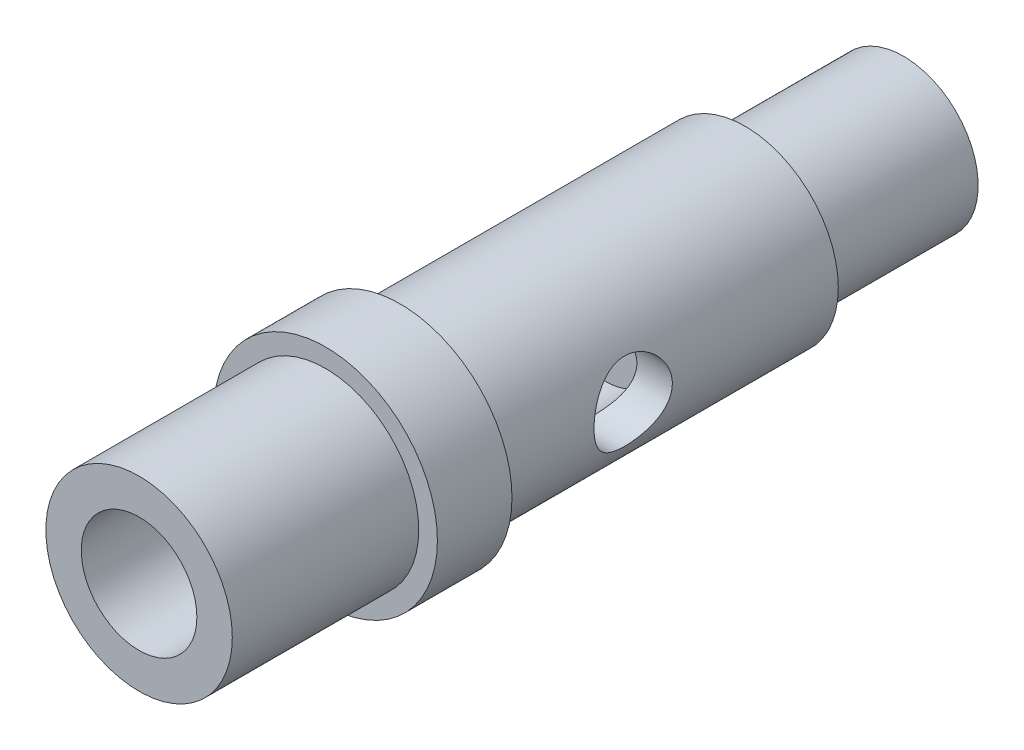
ISO-10303-21;
HEADER;
FILE_DESCRIPTION(('STEP AP214'),'2;1');
FILE_NAME('part.step','',(''),(''),'','','');
FILE_SCHEMA(('AUTOMOTIVE_DESIGN { 1 0 10303 214 1 1 1 1 }'));
ENDSEC;
DATA;
#1=APPLICATION_CONTEXT('core data for automotive mechanical design processes');
#2=APPLICATION_PROTOCOL_DEFINITION('international standard','automotive_design',2000,#1);
#3=PRODUCT_CONTEXT('',#1,'mechanical');
#4=PRODUCT('Part','Part','',(#3));
#5=PRODUCT_RELATED_PRODUCT_CATEGORY('part','',(#4));
#6=PRODUCT_DEFINITION_FORMATION('','',#4);
#7=PRODUCT_DEFINITION_CONTEXT('part definition',#1,'design');
#8=PRODUCT_DEFINITION('design','',#6,#7);
#9=PRODUCT_DEFINITION_SHAPE('','',#8);
#10=(LENGTH_UNIT() NAMED_UNIT(*) SI_UNIT(.MILLI.,.METRE.));
#11=(NAMED_UNIT(*) PLANE_ANGLE_UNIT() SI_UNIT($,.RADIAN.));
#12=(NAMED_UNIT(*) SI_UNIT($,.STERADIAN.) SOLID_ANGLE_UNIT());
#13=UNCERTAINTY_MEASURE_WITH_UNIT(LENGTH_MEASURE(1.E-05),#10,'distance_accuracy_value','');
#14=(GEOMETRIC_REPRESENTATION_CONTEXT(3) GLOBAL_UNCERTAINTY_ASSIGNED_CONTEXT((#13)) GLOBAL_UNIT_ASSIGNED_CONTEXT((#10,
#11,#12)) REPRESENTATION_CONTEXT('',''));
#15=CARTESIAN_POINT('',(0.,0.,0.));
#16=DIRECTION('',(0.,0.,1.));
#17=DIRECTION('',(1.,0.,0.));
#18=AXIS2_PLACEMENT_3D('',#15,#16,#17);
#19=CARTESIAN_POINT('',(0.,0.,18.5));
#20=DIRECTION('',(0.,0.,-1.));
#21=DIRECTION('',(-1.,0.,0.));
#22=AXIS2_PLACEMENT_3D('',#19,#20,#21);
#23=CYLINDRICAL_SURFACE('',#22,5.);
#24=CARTESIAN_POINT('',(-5.,0.,13.1));
#25=CARTESIAN_POINT('',(-4.99999333081063,-0.112421260581154,13.0999912513358));
#26=CARTESIAN_POINT('',(-4.99616592841195,-0.225000407186862,13.0909214164188));
#27=CARTESIAN_POINT('',(-4.98123118003201,-0.446972248377444,13.0549745053768));
#28=CARTESIAN_POINT('',(-4.97010500635269,-0.556355935732331,13.0280513734512));
#29=CARTESIAN_POINT('',(-4.94176430599483,-0.768350398152641,12.9575669353113));
#30=CARTESIAN_POINT('',(-4.92457055376414,-0.870982883258442,12.9140623611996));
#31=CARTESIAN_POINT('',(-4.8857658190477,-1.06739278830026,12.8118871486583));
#32=CARTESIAN_POINT('',(-4.8641561355186,-1.16117280038009,12.7532209687109));
#33=CARTESIAN_POINT('',(-4.81744880427698,-1.3421338261388,12.6192383747268));
#34=CARTESIAN_POINT('',(-4.79223574286274,-1.42880573971969,12.5432749625455));
#35=CARTESIAN_POINT('',(-4.74165902719199,-1.58861874618107,12.3782228521662));
#36=CARTESIAN_POINT('',(-4.71629529988631,-1.66175260846298,12.2891271854696));
#37=CARTESIAN_POINT('',(-4.66686358992508,-1.79604183081054,12.0949219517323));
#38=CARTESIAN_POINT('',(-4.64292449321021,-1.85641196230061,11.989233155181));
#39=CARTESIAN_POINT('',(-4.60088674913593,-1.95829034529051,11.7680506363567));
#40=CARTESIAN_POINT('',(-4.58278504680928,-1.99980846754018,11.6525620828365));
#41=CARTESIAN_POINT('',(-4.55572282316871,-2.06069339629843,11.4209186251976));
#42=CARTESIAN_POINT('',(-4.54635990340002,-2.08104088310876,11.3050703250742));
#43=CARTESIAN_POINT('',(-4.53668036024208,-2.10206556458631,11.0712546231971));
#44=CARTESIAN_POINT('',(-4.53635863218972,-2.10275385885089,10.9532884548446));
#45=CARTESIAN_POINT('',(-4.54445782632957,-2.08517838863869,10.7284272657301));
#46=CARTESIAN_POINT('',(-4.55219766109081,-2.06839112114071,10.621387346636));
#47=CARTESIAN_POINT('',(-4.57439532890142,-2.01882069425823,10.4118140301093));
#48=CARTESIAN_POINT('',(-4.58885447294869,-1.98603441325927,10.3092815163873));
#49=CARTESIAN_POINT('',(-4.62318960000861,-1.90475526538911,10.1090228101453));
#50=CARTESIAN_POINT('',(-4.64317507109548,-1.8559407276577,10.0114467919097));
#51=CARTESIAN_POINT('',(-4.6862864975772,-1.74421855126709,9.82548751924432));
#52=CARTESIAN_POINT('',(-4.70941370110216,-1.68130530506479,9.73710794309471));
#53=CARTESIAN_POINT('',(-4.7586218987971,-1.53682141436928,9.56405042683526));
#54=CARTESIAN_POINT('',(-4.78478586969401,-1.45411153638581,9.48034449146897));
#55=CARTESIAN_POINT('',(-4.83544396849842,-1.27557303481869,9.32766206511843));
#56=CARTESIAN_POINT('',(-4.85993769171256,-1.17974124865653,9.25868913530204));
#57=CARTESIAN_POINT('',(-4.90522758617355,-0.974684985251585,9.13597384500405));
#58=CARTESIAN_POINT('',(-4.92592190978332,-0.865196096354345,9.0826329332761));
#59=CARTESIAN_POINT('',(-4.96049707707325,-0.637707645332219,8.99546952011977));
#60=CARTESIAN_POINT('',(-4.97438174778904,-0.519712906376769,8.96163605359451));
#61=CARTESIAN_POINT('',(-4.99305470954801,-0.286679920590253,8.91649643436089));
#62=CARTESIAN_POINT('',(-4.9983686606607,-0.171936368129356,8.90388621201674));
#63=CARTESIAN_POINT('',(-5.00098385227943,0.0581412446748187,8.89765565725381));
#64=CARTESIAN_POINT('',(-4.99828744042502,0.173475122118157,8.9040297609993));
#65=CARTESIAN_POINT('',(-4.98552504990215,0.395312373831663,8.93465874306735));
#66=CARTESIAN_POINT('',(-4.9758388790051,0.501967273863916,8.95799252472869));
#67=CARTESIAN_POINT('',(-4.95047932164883,0.709728637835152,9.02059068278337));
#68=CARTESIAN_POINT('',(-4.93480518181903,0.810834401783572,9.05985706376007));
#69=CARTESIAN_POINT('',(-4.8983626516293,1.00818189714743,9.15448695615384));
#70=CARTESIAN_POINT('',(-4.87745088709504,1.10417428723488,9.21031345148036));
#71=CARTESIAN_POINT('',(-4.83275775989047,1.2857730017409,9.33597087334487));
#72=CARTESIAN_POINT('',(-4.80897519262205,1.37137493586437,9.40580768685065));
#73=CARTESIAN_POINT('',(-4.75896603015302,1.53629380491232,9.56342906152892));
#74=CARTESIAN_POINT('',(-4.73268731102285,1.61470399849415,9.65214822852966));
#75=CARTESIAN_POINT('',(-4.68218504424202,1.75578239792247,9.84189457857106));
#76=CARTESIAN_POINT('',(-4.65796199244367,1.81844681280032,9.94292471693528));
#77=CARTESIAN_POINT('',(-4.61412955516252,1.92699302654219,10.1566323377572));
#78=CARTESIAN_POINT('',(-4.59459611805935,1.97260446871616,10.2694638769173));
#79=CARTESIAN_POINT('',(-4.56338397318404,2.04378702108546,10.5022855598323));
#80=CARTESIAN_POINT('',(-4.55169864915186,2.06937501482838,10.6222695806153));
#81=CARTESIAN_POINT('',(-4.53852721320537,2.098093753164,10.8559122777025));
#82=CARTESIAN_POINT('',(-4.53631703032196,2.10281966121278,10.9693349012228));
#83=CARTESIAN_POINT('',(-4.54041709192145,2.09395263112575,11.1952929462249));
#84=CARTESIAN_POINT('',(-4.54672597695537,2.0803626157943,11.3078285063796));
#85=CARTESIAN_POINT('',(-4.56648699353873,2.03659654382614,11.5232401848228));
#86=CARTESIAN_POINT('',(-4.57958128170966,2.00724892567788,11.626320610286));
#87=CARTESIAN_POINT('',(-4.61115138706683,1.93361811208319,11.826114240217));
#88=CARTESIAN_POINT('',(-4.6296287212173,1.88933070598751,11.9228256404356));
#89=CARTESIAN_POINT('',(-4.67127236761429,1.78398506506628,12.1135418518623));
#90=CARTESIAN_POINT('',(-4.69465512938921,1.72207244546472,12.2070265834229));
#91=CARTESIAN_POINT('',(-4.74288120419634,1.5844223678344,12.3827788256602));
#92=CARTESIAN_POINT('',(-4.76772503450352,1.50867999331674,12.4650423289533));
#93=CARTESIAN_POINT('',(-4.81829681676583,1.33881414331682,12.6223262248237));
#94=CARTESIAN_POINT('',(-4.84395273633481,1.24374163979691,12.6963503535757));
#95=CARTESIAN_POINT('',(-4.89140406157461,1.04160910493706,12.8274504328955));
#96=CARTESIAN_POINT('',(-4.91319771021995,0.934543653723439,12.8845186778333));
#97=CARTESIAN_POINT('',(-4.9501639165207,0.712909694659774,12.9788868855152));
#98=CARTESIAN_POINT('',(-4.96543696653597,0.598488891919439,13.0164889374133));
#99=CARTESIAN_POINT('',(-4.98242021609108,0.423046442527797,13.0578272578272));
#100=CARTESIAN_POINT('',(-4.98709206933622,0.363983932156321,13.0690926050424));
#101=CARTESIAN_POINT('',(-4.99434801176813,0.244993842675943,13.086523604976));
#102=CARTESIAN_POINT('',(-4.99693345339788,0.185066849625887,13.0926925613123));
#103=CARTESIAN_POINT('',(-4.99947925927613,0.0833788914689165,13.0987597905083));
#104=CARTESIAN_POINT('',(-5.00000247379584,0.0417003073719698,13.1000032451334));
#105=CARTESIAN_POINT('',(-5.,0.,13.1));
#106=B_SPLINE_CURVE_WITH_KNOTS('',3,(#24,#25,#26,#27,#28,#29,#30,#31,#32,#33,#34,#35,#36,#37,
#38,#39,#40,#41,#42,#43,#44,#45,#46,#47,#48,#49,#50,#51,#52,#53,#54,#55,#56,#57,#58,#59,#60,#61,
#62,#63,#64,#65,#66,#67,#68,#69,#70,#71,#72,#73,#74,#75,#76,#77,#78,#79,#80,#81,#82,#83,#84,#85,
#86,#87,#88,#89,#90,#91,#92,#93,#94,#95,#96,#97,#98,#99,#100,#101,#102,#103,#104,#105),
.UNSPECIFIED.,.T.,.F.,(4,2,2,2,2,2,2,2,2,2,2,2,2,2,2,2,2,2,2,2,2,2,2,2,2,2,2,2,2,2,2,2,2,2,2,2,
2,2,2,2,4),(0.,0.337117852409667,0.675108761991064,1.0119534948119,1.34869928621511,
1.70109212353727,2.05367263229609,2.42394551964458,2.79402431110359,3.14607251211167,
3.49792194246532,3.82228185888045,4.14670508743038,4.47808378319006,4.809594514361,
5.16961532097002,5.5297230512783,5.89839924827032,6.26686801055252,6.61173647653922,
6.95650388006773,7.28382587678937,7.61118906878411,7.94874145558542,8.28643597605333,
8.64863382013131,9.01091878393075,9.37872565541545,9.74622206108766,10.0850701575655,
10.4238641880037,10.7463772236012,11.0689812327413,11.4111551885347,11.7534510251225,
12.1212491138851,12.4892140943469,12.8512833058361,13.0320009112093,13.2126012784391,
13.3376480711311),.UNSPECIFIED.);
#107=CARTESIAN_POINT('',(-5.,0.,13.1));
#108=VERTEX_POINT('',#107);
#109=EDGE_CURVE('E63',#108,#108,#106,.T.);
#110=ORIENTED_EDGE('',*,*,#109,.T.);
#111=EDGE_LOOP('',(#110));
#112=FACE_BOUND('',#111,.T.);
#113=CARTESIAN_POINT('',(5.,0.,8.9));
#114=CARTESIAN_POINT('',(4.99999333081063,-0.112421260581154,8.9000087486642));
#115=CARTESIAN_POINT('',(4.99616592841195,-0.225000407186861,8.90907858358119));
#116=CARTESIAN_POINT('',(4.98123118003201,-0.446972248377444,8.94502549462316));
#117=CARTESIAN_POINT('',(4.97010500635269,-0.556355935732331,8.97194862654878));
#118=CARTESIAN_POINT('',(4.94176430599483,-0.76835039815264,9.04243306468874));
#119=CARTESIAN_POINT('',(4.92457055376415,-0.870982883258441,9.08593763880041));
#120=CARTESIAN_POINT('',(4.8857658190477,-1.06739278830026,9.18811285134168));
#121=CARTESIAN_POINT('',(4.8641561355186,-1.16117280038009,9.24677903128911));
#122=CARTESIAN_POINT('',(4.81744880427698,-1.3421338261388,9.38076162527322));
#123=CARTESIAN_POINT('',(4.79223574286274,-1.42880573971969,9.45672503745452));
#124=CARTESIAN_POINT('',(4.74165902719199,-1.58861874618107,9.62177714783384));
#125=CARTESIAN_POINT('',(4.71629529988631,-1.66175260846298,9.7108728145304));
#126=CARTESIAN_POINT('',(4.66686358992508,-1.79604183081054,9.90507804826773));
#127=CARTESIAN_POINT('',(4.64292449321021,-1.85641196230061,10.010766844819));
#128=CARTESIAN_POINT('',(4.60088674913593,-1.95829034529051,10.2319493636433));
#129=CARTESIAN_POINT('',(4.58278504680928,-1.99980846754018,10.3474379171635));
#130=CARTESIAN_POINT('',(4.55572282316871,-2.06069339629843,10.5790813748024));
#131=CARTESIAN_POINT('',(4.54635990340002,-2.08104088310876,10.6949296749258));
#132=CARTESIAN_POINT('',(4.53668036024208,-2.10206556458631,10.9287453768029));
#133=CARTESIAN_POINT('',(4.53635863218972,-2.10275385885089,11.0467115451554));
#134=CARTESIAN_POINT('',(4.54445782632957,-2.08517838863869,11.2715727342699));
#135=CARTESIAN_POINT('',(4.55219766109081,-2.06839112114071,11.378612653364));
#136=CARTESIAN_POINT('',(4.57439532890142,-2.01882069425823,11.5881859698907));
#137=CARTESIAN_POINT('',(4.58885447294869,-1.98603441325927,11.6907184836127));
#138=CARTESIAN_POINT('',(4.62318960000861,-1.90475526538911,11.8909771898547));
#139=CARTESIAN_POINT('',(4.64317507109548,-1.8559407276577,11.9885532080903));
#140=CARTESIAN_POINT('',(4.6862864975772,-1.74421855126709,12.1745124807557));
#141=CARTESIAN_POINT('',(4.70941370110216,-1.68130530506479,12.2628920569053));
#142=CARTESIAN_POINT('',(4.7586218987971,-1.53682141436928,12.4359495731647));
#143=CARTESIAN_POINT('',(4.78478586969401,-1.45411153638581,12.519655508531));
#144=CARTESIAN_POINT('',(4.83544396849842,-1.27557303481869,12.6723379348816));
#145=CARTESIAN_POINT('',(4.85993769171256,-1.17974124865653,12.741310864698));
#146=CARTESIAN_POINT('',(4.90522758617354,-0.974684985251587,12.8640261549959));
#147=CARTESIAN_POINT('',(4.92592190978332,-0.865196096354347,12.9173670667239));
#148=CARTESIAN_POINT('',(4.96049707707325,-0.637707645332221,13.0045304798802));
#149=CARTESIAN_POINT('',(4.97438174778904,-0.51971290637677,13.0383639464055));
#150=CARTESIAN_POINT('',(4.99305470954801,-0.286679920590254,13.0835035656391));
#151=CARTESIAN_POINT('',(4.9983686606607,-0.171936368129357,13.0961137879833));
#152=CARTESIAN_POINT('',(5.00098385227943,0.0581412446748179,13.1023443427462));
#153=CARTESIAN_POINT('',(4.99828744042502,0.173475122118156,13.0959702390007));
#154=CARTESIAN_POINT('',(4.98552504990215,0.395312373831663,13.0653412569326));
#155=CARTESIAN_POINT('',(4.9758388790051,0.501967273863916,13.0420074752713));
#156=CARTESIAN_POINT('',(4.95047932164883,0.709728637835152,12.9794093172166));
#157=CARTESIAN_POINT('',(4.93480518181903,0.810834401783572,12.9401429362399));
#158=CARTESIAN_POINT('',(4.8983626516293,1.00818189714743,12.8455130438462));
#159=CARTESIAN_POINT('',(4.87745088709504,1.10417428723488,12.7896865485196));
#160=CARTESIAN_POINT('',(4.83275775989047,1.2857730017409,12.6640291266551));
#161=CARTESIAN_POINT('',(4.80897519262205,1.37137493586437,12.5941923131494));
#162=CARTESIAN_POINT('',(4.75896603015302,1.53629380491232,12.4365709384711));
#163=CARTESIAN_POINT('',(4.73268731102285,1.61470399849415,12.3478517714703));
#164=CARTESIAN_POINT('',(4.68218504424202,1.75578239792247,12.1581054214289));
#165=CARTESIAN_POINT('',(4.65796199244367,1.81844681280032,12.0570752830647));
#166=CARTESIAN_POINT('',(4.61412955516252,1.92699302654219,11.8433676622428));
#167=CARTESIAN_POINT('',(4.59459611805935,1.97260446871616,11.7305361230827));
#168=CARTESIAN_POINT('',(4.56338397318404,2.04378702108546,11.4977144401677));
#169=CARTESIAN_POINT('',(4.55169864915186,2.06937501482838,11.3777304193847));
#170=CARTESIAN_POINT('',(4.53852721320537,2.098093753164,11.1440877222975));
#171=CARTESIAN_POINT('',(4.53631703032196,2.10281966121278,11.0306650987772));
#172=CARTESIAN_POINT('',(4.54041709192145,2.09395263112575,10.8047070537751));
#173=CARTESIAN_POINT('',(4.54672597695537,2.0803626157943,10.6921714936204));
#174=CARTESIAN_POINT('',(4.56648699353874,2.03659654382614,10.4767598151772));
#175=CARTESIAN_POINT('',(4.57958128170967,2.00724892567788,10.373679389714));
#176=CARTESIAN_POINT('',(4.61115138706684,1.93361811208319,10.173885759783));
#177=CARTESIAN_POINT('',(4.6296287212173,1.88933070598751,10.0771743595644));
#178=CARTESIAN_POINT('',(4.67127236761429,1.78398506506628,9.88645814813767));
#179=CARTESIAN_POINT('',(4.69465512938921,1.72207244546472,9.7929734165771));
#180=CARTESIAN_POINT('',(4.74288120419634,1.5844223678344,9.61722117433984));
#181=CARTESIAN_POINT('',(4.76772503450352,1.50867999331674,9.53495767104669));
#182=CARTESIAN_POINT('',(4.81829681676583,1.33881414331683,9.37767377517628));
#183=CARTESIAN_POINT('',(4.84395273633481,1.24374163979692,9.30364964642428));
#184=CARTESIAN_POINT('',(4.89140406157461,1.04160910493706,9.17254956710446));
#185=CARTESIAN_POINT('',(4.91319771021995,0.93454365372344,9.11548132216668));
#186=CARTESIAN_POINT('',(4.9501639165207,0.712909694659776,9.02111311448475));
#187=CARTESIAN_POINT('',(4.96543696653597,0.598488891919441,8.98351106258665));
#188=CARTESIAN_POINT('',(4.98242021609108,0.423046442527799,8.9421727421728));
#189=CARTESIAN_POINT('',(4.98709206933622,0.363983932156324,8.93090739495763));
#190=CARTESIAN_POINT('',(4.99434801176813,0.244993842675945,8.91347639502403));
#191=CARTESIAN_POINT('',(4.99693345339788,0.185066849625889,8.90730743868773));
#192=CARTESIAN_POINT('',(4.99947925927613,0.0833788914689178,8.90124020949169));
#193=CARTESIAN_POINT('',(5.00000247379584,0.0417003073719704,8.89999675486661));
#194=CARTESIAN_POINT('',(5.,0.,8.9));
#195=B_SPLINE_CURVE_WITH_KNOTS('',3,(#113,#114,#115,#116,#117,#118,#119,#120,#121,#122,#123,
#124,#125,#126,#127,#128,#129,#130,#131,#132,#133,#134,#135,#136,#137,#138,#139,#140,#141,#142,
#143,#144,#145,#146,#147,#148,#149,#150,#151,#152,#153,#154,#155,#156,#157,#158,#159,#160,#161,
#162,#163,#164,#165,#166,#167,#168,#169,#170,#171,#172,#173,#174,#175,#176,#177,#178,#179,#180,
#181,#182,#183,#184,#185,#186,#187,#188,#189,#190,#191,#192,#193,#194),.UNSPECIFIED.,.T.,.F.,(4,
2,2,2,2,2,2,2,2,2,2,2,2,2,2,2,2,2,2,2,2,2,2,2,2,2,2,2,2,2,2,2,2,2,2,2,2,2,2,2,4),(0.,
0.337117852409667,0.675108761991064,1.01195349481189,1.34869928621511,1.70109212353728,
2.0536726322961,2.42394551964458,2.79402431110359,3.14607251211167,3.49792194246532,
3.82228185888045,4.14670508743038,4.47808378319006,4.809594514361,5.16961532097002,
5.52972305127829,5.89839924827032,6.26686801055252,6.61173647653922,6.95650388006772,
7.28382587678937,7.61118906878411,7.94874145558542,8.28643597605333,8.64863382013131,
9.01091878393075,9.37872565541545,9.74622206108766,10.0850701575655,10.4238641880037,
10.7463772236013,11.0689812327413,11.4111551885347,11.7534510251225,12.1212491138851,
12.4892140943469,12.851283305836,13.0320009112093,13.2126012784391,13.3376480711311),.UNSPECIFIED.);
#196=CARTESIAN_POINT('',(5.,0.,8.9));
#197=VERTEX_POINT('',#196);
#198=EDGE_CURVE('E57',#197,#197,#195,.T.);
#199=ORIENTED_EDGE('',*,*,#198,.T.);
#200=EDGE_LOOP('',(#199));
#201=FACE_BOUND('',#200,.T.);
#202=CARTESIAN_POINT('',(0.,0.,18.5));
#203=DIRECTION('',(0.,0.,1.));
#204=DIRECTION('',(1.,0.,0.));
#205=AXIS2_PLACEMENT_3D('',#202,#203,#204);
#206=CIRCLE('',#205,5.);
#207=CARTESIAN_POINT('',(5.,0.,18.5));
#208=VERTEX_POINT('',#207);
#209=EDGE_CURVE('E51',#208,#208,#206,.T.);
#210=ORIENTED_EDGE('',*,*,#209,.F.);
#211=EDGE_LOOP('',(#210));
#212=FACE_BOUND('',#211,.T.);
#213=CARTESIAN_POINT('',(0.,0.,0.));
#214=DIRECTION('',(0.,0.,1.));
#215=DIRECTION('',(1.,0.,0.));
#216=AXIS2_PLACEMENT_3D('',#213,#214,#215);
#217=CIRCLE('',#216,5.);
#218=CARTESIAN_POINT('',(5.,0.,0.));
#219=VERTEX_POINT('',#218);
#220=EDGE_CURVE('E87',#219,#219,#217,.T.);
#221=ORIENTED_EDGE('',*,*,#220,.T.);
#222=EDGE_LOOP('',(#221));
#223=FACE_BOUND('',#222,.T.);
#224=ADVANCED_FACE('F33',(#112,#201,#212,#223),#23,.T.);
#225=CARTESIAN_POINT('',(0.,0.,0.));
#226=DIRECTION('',(0.,0.,1.));
#227=DIRECTION('',(1.,0.,0.));
#228=AXIS2_PLACEMENT_3D('',#225,#226,#227);
#229=PLANE('',#228);
#230=CARTESIAN_POINT('',(0.,0.,0.));
#231=DIRECTION('',(0.,0.,-1.));
#232=DIRECTION('',(-1.,0.,0.));
#233=AXIS2_PLACEMENT_3D('',#230,#231,#232);
#234=CIRCLE('',#233,4.);
#235=CARTESIAN_POINT('',(-4.,0.,0.));
#236=VERTEX_POINT('',#235);
#237=EDGE_CURVE('E10',#236,#236,#234,.T.);
#238=ORIENTED_EDGE('',*,*,#237,.F.);
#239=EDGE_LOOP('',(#238));
#240=FACE_BOUND('',#239,.T.);
#241=ORIENTED_EDGE('',*,*,#220,.F.);
#242=EDGE_LOOP('',(#241));
#243=FACE_BOUND('',#242,.T.);
#244=ADVANCED_FACE('F113',(#240,#243),#229,.F.);
#245=CARTESIAN_POINT('',(0.,0.,22.5));
#246=DIRECTION('',(0.,0.,-1.));
#247=DIRECTION('',(-1.,0.,0.));
#248=AXIS2_PLACEMENT_3D('',#245,#246,#247);
#249=CYLINDRICAL_SURFACE('',#248,6.);
#250=CARTESIAN_POINT('',(0.,0.,22.5));
#251=DIRECTION('',(0.,0.,1.));
#252=DIRECTION('',(1.,0.,0.));
#253=AXIS2_PLACEMENT_3D('',#250,#251,#252);
#254=CIRCLE('',#253,6.);
#255=CARTESIAN_POINT('',(6.,0.,22.5));
#256=VERTEX_POINT('',#255);
#257=EDGE_CURVE('E125',#256,#256,#254,.T.);
#258=ORIENTED_EDGE('',*,*,#257,.F.);
#259=EDGE_LOOP('',(#258));
#260=FACE_BOUND('',#259,.T.);
#261=CARTESIAN_POINT('',(0.,0.,18.5));
#262=DIRECTION('',(0.,0.,1.));
#263=DIRECTION('',(1.,0.,0.));
#264=AXIS2_PLACEMENT_3D('',#261,#262,#263);
#265=CIRCLE('',#264,6.);
#266=CARTESIAN_POINT('',(6.,0.,18.5));
#267=VERTEX_POINT('',#266);
#268=EDGE_CURVE('E128',#267,#267,#265,.T.);
#269=ORIENTED_EDGE('',*,*,#268,.T.);
#270=EDGE_LOOP('',(#269));
#271=FACE_BOUND('',#270,.T.);
#272=ADVANCED_FACE('F107',(#260,#271),#249,.T.);
#273=CARTESIAN_POINT('',(0.,0.,22.5));
#274=DIRECTION('',(0.,0.,1.));
#275=DIRECTION('',(1.,0.,0.));
#276=AXIS2_PLACEMENT_3D('',#273,#274,#275);
#277=PLANE('',#276);
#278=CARTESIAN_POINT('',(0.,0.,22.5));
#279=DIRECTION('',(0.,0.,1.));
#280=DIRECTION('',(1.,0.,0.));
#281=AXIS2_PLACEMENT_3D('',#278,#279,#280);
#282=CIRCLE('',#281,5.);
#283=CARTESIAN_POINT('',(5.,0.,22.5));
#284=VERTEX_POINT('',#283);
#285=EDGE_CURVE('E46',#284,#284,#282,.T.);
#286=ORIENTED_EDGE('',*,*,#285,.F.);
#287=EDGE_LOOP('',(#286));
#288=FACE_BOUND('',#287,.T.);
#289=ORIENTED_EDGE('',*,*,#257,.T.);
#290=EDGE_LOOP('',(#289));
#291=FACE_BOUND('',#290,.T.);
#292=ADVANCED_FACE('F104',(#288,#291),#277,.T.);
#293=CARTESIAN_POINT('',(0.,0.,18.5));
#294=DIRECTION('',(0.,0.,1.));
#295=DIRECTION('',(1.,0.,0.));
#296=AXIS2_PLACEMENT_3D('',#293,#294,#295);
#297=PLANE('',#296);
#298=ORIENTED_EDGE('',*,*,#209,.T.);
#299=EDGE_LOOP('',(#298));
#300=FACE_BOUND('',#299,.T.);
#301=ORIENTED_EDGE('',*,*,#268,.F.);
#302=EDGE_LOOP('',(#301));
#303=FACE_BOUND('',#302,.T.);
#304=ADVANCED_FACE('F102',(#300,#303),#297,.F.);
#305=CARTESIAN_POINT('',(0.,0.,32.5));
#306=DIRECTION('',(0.,0.,-1.));
#307=DIRECTION('',(-1.,0.,0.));
#308=AXIS2_PLACEMENT_3D('',#305,#306,#307);
#309=CYLINDRICAL_SURFACE('',#308,5.);
#310=CARTESIAN_POINT('',(0.,0.,32.5));
#311=DIRECTION('',(0.,0.,1.));
#312=DIRECTION('',(1.,0.,0.));
#313=AXIS2_PLACEMENT_3D('',#310,#311,#312);
#314=CIRCLE('',#313,5.);
#315=CARTESIAN_POINT('',(5.,0.,32.5));
#316=VERTEX_POINT('',#315);
#317=EDGE_CURVE('E133',#316,#316,#314,.T.);
#318=ORIENTED_EDGE('',*,*,#317,.F.);
#319=EDGE_LOOP('',(#318));
#320=FACE_BOUND('',#319,.T.);
#321=ORIENTED_EDGE('',*,*,#285,.T.);
#322=EDGE_LOOP('',(#321));
#323=FACE_BOUND('',#322,.T.);
#324=ADVANCED_FACE('F98',(#320,#323),#309,.T.);
#325=CARTESIAN_POINT('',(0.,0.,32.5));
#326=DIRECTION('',(0.,0.,1.));
#327=DIRECTION('',(1.,0.,0.));
#328=AXIS2_PLACEMENT_3D('',#325,#326,#327);
#329=PLANE('',#328);
#330=CARTESIAN_POINT('',(0.,0.,32.5));
#331=DIRECTION('',(0.,0.,1.));
#332=DIRECTION('',(1.,0.,0.));
#333=AXIS2_PLACEMENT_3D('',#330,#331,#332);
#334=CIRCLE('',#333,3.1);
#335=CARTESIAN_POINT('',(3.1,0.,32.5));
#336=VERTEX_POINT('',#335);
#337=EDGE_CURVE('E139',#336,#336,#334,.T.);
#338=ORIENTED_EDGE('',*,*,#337,.F.);
#339=EDGE_LOOP('',(#338));
#340=FACE_BOUND('',#339,.T.);
#341=ORIENTED_EDGE('',*,*,#317,.T.);
#342=EDGE_LOOP('',(#341));
#343=FACE_BOUND('',#342,.T.);
#344=ADVANCED_FACE('F93',(#340,#343),#329,.T.);
#345=CARTESIAN_POINT('',(0.,0.,7.5));
#346=DIRECTION('',(0.,0.,1.));
#347=DIRECTION('',(1.,0.,0.));
#348=AXIS2_PLACEMENT_3D('',#345,#346,#347);
#349=CYLINDRICAL_SURFACE('',#348,3.1);
#350=CARTESIAN_POINT('',(3.1,0.,8.9));
#351=CARTESIAN_POINT('',(3.09999560596076,0.105122629652994,8.90000481997851));
#352=CARTESIAN_POINT('',(3.0946037638946,0.210278769833455,8.90794121362818));
#353=CARTESIAN_POINT('',(3.07355825493448,0.41723804360764,8.93920161544159));
#354=CARTESIAN_POINT('',(3.05789694751085,0.519038621373334,8.96253708066814));
#355=CARTESIAN_POINT('',(3.01785587898344,0.715962485627247,9.0231420010301));
#356=CARTESIAN_POINT('',(2.9935186842469,0.811115706861887,9.06034346553354));
#357=CARTESIAN_POINT('',(2.93806342665084,0.993415718354877,9.14707610182492));
#358=CARTESIAN_POINT('',(2.90694465080881,1.08056166539671,9.19660857011275));
#359=CARTESIAN_POINT('',(2.83720369575503,1.25285177302503,9.3112208163672));
#360=CARTESIAN_POINT('',(2.79816624818737,1.33717821939561,9.37727174619383));
#361=CARTESIAN_POINT('',(2.71750286085684,1.49432214818745,9.52069574054932));
#362=CARTESIAN_POINT('',(2.67587320021174,1.56712252947532,9.59808530658278));
#363=CARTESIAN_POINT('',(2.58642878571182,1.71134304821511,9.77665843519562));
#364=CARTESIAN_POINT('',(2.53871664033241,1.78058795162594,9.87966331067803));
#365=CARTESIAN_POINT('',(2.45005456569437,1.90073814665917,10.0984963537117));
#366=CARTESIAN_POINT('',(2.40909305534642,1.95167502785278,10.2143019782311));
#367=CARTESIAN_POINT('',(2.35129596502956,2.02059481744015,10.4209593043378));
#368=CARTESIAN_POINT('',(2.33090802095176,2.04386979957103,10.509041811893));
#369=CARTESIAN_POINT('',(2.29975407320284,2.07886818893329,10.6890656905882));
#370=CARTESIAN_POINT('',(2.2889709301819,2.09061217657166,10.780999880267));
#371=CARTESIAN_POINT('',(2.27870408174552,2.10180300803875,10.9667006281494));
#372=CARTESIAN_POINT('',(2.27927238291207,2.10119325307818,11.0604736526684));
#373=CARTESIAN_POINT('',(2.29174000805483,2.08758290545534,11.2463720935404));
#374=CARTESIAN_POINT('',(2.30364756914491,2.07457330523809,11.3384962625582));
#375=CARTESIAN_POINT('',(2.33602989260148,2.03801670352301,11.5139258311859));
#376=CARTESIAN_POINT('',(2.35603860552697,2.01503870427072,11.5974414790624));
#377=CARTESIAN_POINT('',(2.40224615844183,1.95972243671935,11.759493998112));
#378=CARTESIAN_POINT('',(2.42844977533213,1.92737694077533,11.8380269675628));
#379=CARTESIAN_POINT('',(2.49842047048817,1.8364552709908,12.0261699602599));
#380=CARTESIAN_POINT('',(2.54455271296684,1.77275875219908,12.132440617071));
#381=CARTESIAN_POINT('',(2.63926660328725,1.62842006964715,12.3316987285033));
#382=CARTESIAN_POINT('',(2.68785262117138,1.54774679988968,12.4246612663141));
#383=CARTESIAN_POINT('',(2.7827551372419,1.36986379035528,12.5965221605788));
#384=CARTESIAN_POINT('',(2.829049403228,1.27252211791738,12.6752971361444));
#385=CARTESIAN_POINT('',(2.91416065871388,1.06318728335551,12.8153277135144));
#386=CARTESIAN_POINT('',(2.95299300462064,0.951225025652632,12.8766194241483));
#387=CARTESIAN_POINT('',(3.01158027456433,0.741285677911275,12.9673648801874));
#388=CARTESIAN_POINT('',(3.03365554690921,0.645702127020385,13.000863379878));
#389=CARTESIAN_POINT('',(3.0689074036092,0.449161093511957,13.0539207768184));
#390=CARTESIAN_POINT('',(3.08208997108004,0.348207273509191,13.0734890469804));
#391=CARTESIAN_POINT('',(3.09839242632695,0.143359019486559,13.0976454116152));
#392=CARTESIAN_POINT('',(3.10147919606585,0.0394560329496028,13.1021842043184));
#393=CARTESIAN_POINT('',(3.09719505022975,-0.167665191579226,13.0958584838427));
#394=CARTESIAN_POINT('',(3.08982350274355,-0.27088338781618,13.084993039911));
#395=CARTESIAN_POINT('',(3.06597052294567,-0.468187532740171,13.0494719807824));
#396=CARTESIAN_POINT('',(3.04997932646518,-0.562469797525217,13.0255576819574));
#397=CARTESIAN_POINT('',(3.01050398309594,-0.745407130204282,12.9656148205816));
#398=CARTESIAN_POINT('',(2.98701846517864,-0.834061164896047,12.9295840413487));
#399=CARTESIAN_POINT('',(2.93202051208104,-1.01121144048806,12.8433497853627));
#400=CARTESIAN_POINT('',(2.90000891097908,-1.09910257902559,12.7922286435421));
#401=CARTESIAN_POINT('',(2.83138354020451,-1.26545670193958,12.6789180588007));
#402=CARTESIAN_POINT('',(2.79476618703501,-1.34391225097459,12.6167199816474));
#403=CARTESIAN_POINT('',(2.71301453433088,-1.5029348019084,12.4712793239752));
#404=CARTESIAN_POINT('',(2.66747859861655,-1.58166979542546,12.3862569932855));
#405=CARTESIAN_POINT('',(2.57748916413306,-1.72443261760175,12.2040493280429));
#406=CARTESIAN_POINT('',(2.533036091058,-1.78845474317752,12.1068592994537));
#407=CARTESIAN_POINT('',(2.45614630899741,-1.89232747273138,11.9160415894921));
#408=CARTESIAN_POINT('',(2.42290109597277,-1.93433174545664,11.8239185343953));
#409=CARTESIAN_POINT('',(2.36464888576683,-2.00513079767863,11.6323214978012));
#410=CARTESIAN_POINT('',(2.3396257534672,-2.03395149294137,11.532862388315));
#411=CARTESIAN_POINT('',(2.30473804096001,-2.07334719372397,11.3448488541556));
#412=CARTESIAN_POINT('',(2.2930903120863,-2.08610164644759,11.2570910804957));
#413=CARTESIAN_POINT('',(2.28004709814699,-2.10035439777918,11.0799338680127));
#414=CARTESIAN_POINT('',(2.27864305041999,-2.10186209753685,10.9905358629423));
#415=CARTESIAN_POINT('',(2.28629610661776,-2.09353186518967,10.8128185325626));
#416=CARTESIAN_POINT('',(2.2953451208651,-2.08370270674563,10.7244984264881));
#417=CARTESIAN_POINT('',(2.32252545965891,-2.05335799733383,10.5511199121198));
#418=CARTESIAN_POINT('',(2.34066941963299,-2.03282757773077,10.4660662192663));
#419=CARTESIAN_POINT('',(2.39080179137221,-1.9738280427558,10.2739743855073));
#420=CARTESIAN_POINT('',(2.42537118955664,-1.93170184829235,10.1687429021959));
#421=CARTESIAN_POINT('',(2.50117776551554,-1.83248669438483,9.96822603408129));
#422=CARTESIAN_POINT('',(2.54242491962489,-1.77537526703286,9.87295588719822));
#423=CARTESIAN_POINT('',(2.6279177564585,-1.64625574411574,9.69138295076429));
#424=CARTESIAN_POINT('',(2.67220643365107,-1.57397698254017,9.60529315421236));
#425=CARTESIAN_POINT('',(2.75910749137738,-1.41614493149011,9.44527114577247));
#426=CARTESIAN_POINT('',(2.80171941212839,-1.33058803238419,9.37134225108867));
#427=CARTESIAN_POINT('',(2.88652581382917,-1.13598732395742,9.22922024977434));
#428=CARTESIAN_POINT('',(2.92807044317878,-1.02536111489358,9.16274942349072));
#429=CARTESIAN_POINT('',(2.98191218781676,-0.849689293482353,9.07847592964872));
#430=CARTESIAN_POINT('',(2.99844292380778,-0.789530970519942,9.05296265038746));
#431=CARTESIAN_POINT('',(3.02818977826089,-0.666387392641889,9.0074559348531));
#432=CARTESIAN_POINT('',(3.04140749396994,-0.603403517293837,8.98745983820936));
#433=CARTESIAN_POINT('',(3.06810366692972,-0.452249632089202,8.9473034095795));
#434=CARTESIAN_POINT('',(3.07999164209456,-0.363113210188207,8.92963136275439));
#435=CARTESIAN_POINT('',(3.09594008361364,-0.182659007819054,8.90598000482105));
#436=CARTESIAN_POINT('',(3.10000381802673,-0.0913421542243956,8.89999581187017));
#437=CARTESIAN_POINT('',(3.1,0.,8.9));
#438=B_SPLINE_CURVE_WITH_KNOTS('',3,(#350,#351,#352,#353,#354,#355,#356,#357,#358,#359,#360,
#361,#362,#363,#364,#365,#366,#367,#368,#369,#370,#371,#372,#373,#374,#375,#376,#377,#378,#379,
#380,#381,#382,#383,#384,#385,#386,#387,#388,#389,#390,#391,#392,#393,#394,#395,#396,#397,#398,
#399,#400,#401,#402,#403,#404,#405,#406,#407,#408,#409,#410,#411,#412,#413,#414,#415,#416,#417,
#418,#419,#420,#421,#422,#423,#424,#425,#426,#427,#428,#429,#430,#431,#432,#433,#434,#435,#436,
#437),.UNSPECIFIED.,.T.,.F.,(4,2,2,2,2,2,2,2,2,2,2,2,2,2,2,2,2,2,2,2,2,2,2,2,2,2,2,2,2,2,2,2,2,
2,2,2,2,2,2,2,2,2,2,4),(0.,0.315006018395262,0.630246669049076,0.943961477622663,
1.25770928457411,1.598458401065,1.93970844007047,2.33679953504221,2.73320214235469,
3.01218662500566,3.29067226880842,3.57043408457253,3.85039928126673,4.11613919672789,
4.38208469691398,4.77665214062066,5.17194893328605,5.57053286853108,5.96828753255126,
6.27796038776939,6.58742468311204,6.89790312563174,7.20840032864222,7.50285893451758,
7.797371440246,8.11595476035371,8.43478750494567,8.80681996130451,9.17899638461549,
9.49754480332084,9.81546431211952,10.08258899513,10.3494903638338,10.616185314526,
10.8832518104042,11.2368560911558,11.5909936037301,11.9520898760814,12.3132844841351,
12.7173498999852,12.9192520066488,13.1210565858344,13.3948830130876,13.6685950426368),.UNSPECIFIED.);
#439=CARTESIAN_POINT('',(3.1,0.,8.9));
#440=VERTEX_POINT('',#439);
#441=EDGE_CURVE('E37',#440,#440,#438,.T.);
#442=ORIENTED_EDGE('',*,*,#441,.T.);
#443=EDGE_LOOP('',(#442));
#444=FACE_BOUND('',#443,.T.);
#445=CARTESIAN_POINT('',(-3.1,0.,8.9));
#446=CARTESIAN_POINT('',(-3.09999560596076,-0.105122629652994,8.90000481997851));
#447=CARTESIAN_POINT('',(-3.0946037638946,-0.210278769833455,8.90794121362818));
#448=CARTESIAN_POINT('',(-3.07355825493448,-0.41723804360764,8.93920161544159));
#449=CARTESIAN_POINT('',(-3.05789694751085,-0.519038621373334,8.96253708066814));
#450=CARTESIAN_POINT('',(-3.01785587898344,-0.715962485627246,9.0231420010301));
#451=CARTESIAN_POINT('',(-2.9935186842469,-0.811115706861886,9.06034346553354));
#452=CARTESIAN_POINT('',(-2.93806342665084,-0.993415718354876,9.14707610182492));
#453=CARTESIAN_POINT('',(-2.90694465080881,-1.08056166539671,9.19660857011275));
#454=CARTESIAN_POINT('',(-2.83720369575503,-1.25285177302503,9.3112208163672));
#455=CARTESIAN_POINT('',(-2.79816624818737,-1.3371782193956,9.37727174619383));
#456=CARTESIAN_POINT('',(-2.71750286085684,-1.49432214818745,9.52069574054932));
#457=CARTESIAN_POINT('',(-2.67587320021174,-1.56712252947532,9.59808530658278));
#458=CARTESIAN_POINT('',(-2.58642878571182,-1.71134304821511,9.77665843519562));
#459=CARTESIAN_POINT('',(-2.53871664033241,-1.78058795162594,9.87966331067803));
#460=CARTESIAN_POINT('',(-2.45005456569437,-1.90073814665917,10.0984963537117));
#461=CARTESIAN_POINT('',(-2.40909305534642,-1.95167502785278,10.2143019782311));
#462=CARTESIAN_POINT('',(-2.35129596502956,-2.02059481744015,10.4209593043378));
#463=CARTESIAN_POINT('',(-2.33090802095176,-2.04386979957103,10.509041811893));
#464=CARTESIAN_POINT('',(-2.29975407320284,-2.07886818893329,10.6890656905882));
#465=CARTESIAN_POINT('',(-2.2889709301819,-2.09061217657166,10.780999880267));
#466=CARTESIAN_POINT('',(-2.27870408174552,-2.10180300803875,10.9667006281494));
#467=CARTESIAN_POINT('',(-2.27927238291207,-2.10119325307818,11.0604736526684));
#468=CARTESIAN_POINT('',(-2.29174000805483,-2.08758290545534,11.2463720935404));
#469=CARTESIAN_POINT('',(-2.30364756914491,-2.07457330523808,11.3384962625582));
#470=CARTESIAN_POINT('',(-2.33602989260148,-2.03801670352301,11.5139258311859));
#471=CARTESIAN_POINT('',(-2.35603860552697,-2.01503870427072,11.5974414790624));
#472=CARTESIAN_POINT('',(-2.40224615844183,-1.95972243671936,11.759493998112));
#473=CARTESIAN_POINT('',(-2.42844977533213,-1.92737694077533,11.8380269675628));
#474=CARTESIAN_POINT('',(-2.49842047048817,-1.8364552709908,12.0261699602599));
#475=CARTESIAN_POINT('',(-2.54455271296684,-1.77275875219908,12.132440617071));
#476=CARTESIAN_POINT('',(-2.63926660328725,-1.62842006964715,12.3316987285033));
#477=CARTESIAN_POINT('',(-2.68785262117138,-1.54774679988968,12.4246612663141));
#478=CARTESIAN_POINT('',(-2.7827551372419,-1.36986379035528,12.5965221605788));
#479=CARTESIAN_POINT('',(-2.829049403228,-1.27252211791738,12.6752971361444));
#480=CARTESIAN_POINT('',(-2.91416065871388,-1.06318728335551,12.8153277135144));
#481=CARTESIAN_POINT('',(-2.95299300462064,-0.951225025652632,12.8766194241483));
#482=CARTESIAN_POINT('',(-3.01158027456433,-0.741285677911274,12.9673648801874));
#483=CARTESIAN_POINT('',(-3.03365554690921,-0.645702127020385,13.000863379878));
#484=CARTESIAN_POINT('',(-3.0689074036092,-0.449161093511957,13.0539207768184));
#485=CARTESIAN_POINT('',(-3.08208997108004,-0.34820727350919,13.0734890469804));
#486=CARTESIAN_POINT('',(-3.09839242632695,-0.143359019486558,13.0976454116152));
#487=CARTESIAN_POINT('',(-3.10147919606585,-0.0394560329496016,13.1021842043184));
#488=CARTESIAN_POINT('',(-3.09719505022975,0.167665191579227,13.0958584838427));
#489=CARTESIAN_POINT('',(-3.08982350274355,0.270883387816181,13.084993039911));
#490=CARTESIAN_POINT('',(-3.06597052294567,0.468187532740171,13.0494719807824));
#491=CARTESIAN_POINT('',(-3.04997932646518,0.562469797525217,13.0255576819574));
#492=CARTESIAN_POINT('',(-3.01050398309594,0.745407130204282,12.9656148205816));
#493=CARTESIAN_POINT('',(-2.98701846517864,0.834061164896047,12.9295840413487));
#494=CARTESIAN_POINT('',(-2.93202051208104,1.01121144048806,12.8433497853627));
#495=CARTESIAN_POINT('',(-2.90000891097908,1.09910257902559,12.7922286435421));
#496=CARTESIAN_POINT('',(-2.83138354020451,1.26545670193958,12.6789180588007));
#497=CARTESIAN_POINT('',(-2.79476618703501,1.34391225097459,12.6167199816474));
#498=CARTESIAN_POINT('',(-2.71301453433088,1.5029348019084,12.4712793239752));
#499=CARTESIAN_POINT('',(-2.66747859861655,1.58166979542546,12.3862569932855));
#500=CARTESIAN_POINT('',(-2.57748916413306,1.72443261760174,12.2040493280429));
#501=CARTESIAN_POINT('',(-2.533036091058,1.78845474317752,12.1068592994537));
#502=CARTESIAN_POINT('',(-2.45614630899742,1.89232747273138,11.9160415894921));
#503=CARTESIAN_POINT('',(-2.42290109597277,1.93433174545664,11.8239185343953));
#504=CARTESIAN_POINT('',(-2.36464888576683,2.00513079767863,11.6323214978012));
#505=CARTESIAN_POINT('',(-2.3396257534672,2.03395149294137,11.532862388315));
#506=CARTESIAN_POINT('',(-2.30473804096001,2.07334719372397,11.3448488541556));
#507=CARTESIAN_POINT('',(-2.2930903120863,2.08610164644759,11.2570910804957));
#508=CARTESIAN_POINT('',(-2.28004709814699,2.10035439777918,11.0799338680127));
#509=CARTESIAN_POINT('',(-2.27864305041999,2.10186209753685,10.9905358629423));
#510=CARTESIAN_POINT('',(-2.28629610661776,2.09353186518967,10.8128185325626));
#511=CARTESIAN_POINT('',(-2.2953451208651,2.08370270674563,10.7244984264881));
#512=CARTESIAN_POINT('',(-2.32252545965891,2.05335799733383,10.5511199121198));
#513=CARTESIAN_POINT('',(-2.34066941963299,2.03282757773077,10.4660662192663));
#514=CARTESIAN_POINT('',(-2.39080179137221,1.97382804275579,10.2739743855073));
#515=CARTESIAN_POINT('',(-2.42537118955664,1.93170184829234,10.1687429021959));
#516=CARTESIAN_POINT('',(-2.50117776551554,1.83248669438483,9.96822603408129));
#517=CARTESIAN_POINT('',(-2.54242491962489,1.77537526703285,9.87295588719821));
#518=CARTESIAN_POINT('',(-2.6279177564585,1.64625574411574,9.69138295076428));
#519=CARTESIAN_POINT('',(-2.67220643365107,1.57397698254017,9.60529315421235));
#520=CARTESIAN_POINT('',(-2.75910749137738,1.4161449314901,9.44527114577247));
#521=CARTESIAN_POINT('',(-2.80171941212839,1.33058803238418,9.37134225108867));
#522=CARTESIAN_POINT('',(-2.88652581382917,1.13598732395741,9.22922024977433));
#523=CARTESIAN_POINT('',(-2.92807044317878,1.02536111489357,9.16274942349071));
#524=CARTESIAN_POINT('',(-2.98191218781676,0.849689293482345,9.07847592964872));
#525=CARTESIAN_POINT('',(-2.99844292380778,0.789530970519935,9.05296265038746));
#526=CARTESIAN_POINT('',(-3.02818977826089,0.666387392641882,9.00745593485309));
#527=CARTESIAN_POINT('',(-3.04140749396994,0.60340351729383,8.98745983820936));
#528=CARTESIAN_POINT('',(-3.06810366692972,0.452249632089195,8.9473034095795));
#529=CARTESIAN_POINT('',(-3.07999164209457,0.363113210188201,8.92963136275439));
#530=CARTESIAN_POINT('',(-3.09594008361365,0.182659007819051,8.90598000482105));
#531=CARTESIAN_POINT('',(-3.10000381802673,0.0913421542243944,8.89999581187017));
#532=CARTESIAN_POINT('',(-3.1,0.,8.9));
#533=B_SPLINE_CURVE_WITH_KNOTS('',3,(#445,#446,#447,#448,#449,#450,#451,#452,#453,#454,#455,
#456,#457,#458,#459,#460,#461,#462,#463,#464,#465,#466,#467,#468,#469,#470,#471,#472,#473,#474,
#475,#476,#477,#478,#479,#480,#481,#482,#483,#484,#485,#486,#487,#488,#489,#490,#491,#492,#493,
#494,#495,#496,#497,#498,#499,#500,#501,#502,#503,#504,#505,#506,#507,#508,#509,#510,#511,#512,
#513,#514,#515,#516,#517,#518,#519,#520,#521,#522,#523,#524,#525,#526,#527,#528,#529,#530,#531,
#532),.UNSPECIFIED.,.T.,.F.,(4,2,2,2,2,2,2,2,2,2,2,2,2,2,2,2,2,2,2,2,2,2,2,2,2,2,2,2,2,2,2,2,2,
2,2,2,2,2,2,2,2,2,2,4),(0.,0.315006018395261,0.630246669049076,0.943961477622661,
1.25770928457411,1.598458401065,1.93970844007047,2.33679953504221,2.73320214235468,
3.01218662500566,3.29067226880842,3.57043408457253,3.85039928126673,4.11613919672788,
4.38208469691398,4.77665214062066,5.17194893328605,5.57053286853108,5.96828753255126,
6.27796038776939,6.58742468311204,6.89790312563174,7.20840032864222,7.50285893451758,
7.797371440246,8.11595476035371,8.43478750494567,8.8068199613045,9.17899638461548,
9.49754480332084,9.81546431211952,10.08258899513,10.3494903638338,10.616185314526,
10.8832518104043,11.2368560911558,11.5909936037301,11.9520898760814,12.3132844841351,
12.7173498999853,12.9192520066488,13.1210565858345,13.3948830130876,13.6685950426368),.UNSPECIFIED.);
#534=CARTESIAN_POINT('',(-3.1,0.,8.9));
#535=VERTEX_POINT('',#534);
#536=EDGE_CURVE('E80',#535,#535,#533,.T.);
#537=ORIENTED_EDGE('',*,*,#536,.T.);
#538=EDGE_LOOP('',(#537));
#539=FACE_BOUND('',#538,.T.);
#540=CARTESIAN_POINT('',(0.,0.,7.5));
#541=DIRECTION('',(0.,0.,1.));
#542=DIRECTION('',(1.,0.,0.));
#543=AXIS2_PLACEMENT_3D('',#540,#541,#542);
#544=CIRCLE('',#543,3.1);
#545=CARTESIAN_POINT('',(3.1,0.,7.5));
#546=VERTEX_POINT('',#545);
#547=EDGE_CURVE('E138',#546,#546,#544,.T.);
#548=ORIENTED_EDGE('',*,*,#547,.F.);
#549=EDGE_LOOP('',(#548));
#550=FACE_BOUND('',#549,.T.);
#551=ORIENTED_EDGE('',*,*,#337,.T.);
#552=EDGE_LOOP('',(#551));
#553=FACE_BOUND('',#552,.T.);
#554=ADVANCED_FACE('F89',(#444,#539,#550,#553),#349,.F.);
#555=CARTESIAN_POINT('',(0.,0.,7.5));
#556=DIRECTION('',(0.,0.,1.));
#557=DIRECTION('',(1.,0.,0.));
#558=AXIS2_PLACEMENT_3D('',#555,#556,#557);
#559=PLANE('',#558);
#560=CARTESIAN_POINT('',(0.,0.,7.5));
#561=DIRECTION('',(0.,0.,1.));
#562=DIRECTION('',(1.,0.,0.));
#563=AXIS2_PLACEMENT_3D('',#560,#561,#562);
#564=CIRCLE('',#563,1.6);
#565=CARTESIAN_POINT('',(1.6,0.,7.5));
#566=VERTEX_POINT('',#565);
#567=EDGE_CURVE('E157',#566,#566,#564,.T.);
#568=ORIENTED_EDGE('',*,*,#567,.F.);
#569=EDGE_LOOP('',(#568));
#570=FACE_BOUND('',#569,.T.);
#571=ORIENTED_EDGE('',*,*,#547,.T.);
#572=EDGE_LOOP('',(#571));
#573=FACE_BOUND('',#572,.T.);
#574=ADVANCED_FACE('F74',(#570,#573),#559,.T.);
#575=CARTESIAN_POINT('',(-6.,0.,11.));
#576=DIRECTION('',(1.,0.,0.));
#577=DIRECTION('',(0.,0.,-1.));
#578=AXIS2_PLACEMENT_3D('',#575,#576,#577);
#579=CYLINDRICAL_SURFACE('',#578,2.1);
#580=ORIENTED_EDGE('',*,*,#536,.F.);
#581=EDGE_LOOP('',(#580));
#582=FACE_BOUND('',#581,.T.);
#583=ORIENTED_EDGE('',*,*,#109,.F.);
#584=EDGE_LOOP('',(#583));
#585=FACE_BOUND('',#584,.T.);
#586=ADVANCED_FACE('F68',(#582,#585),#579,.F.);
#587=ORIENTED_EDGE('',*,*,#441,.F.);
#588=EDGE_LOOP('',(#587));
#589=FACE_BOUND('',#588,.T.);
#590=ORIENTED_EDGE('',*,*,#198,.F.);
#591=EDGE_LOOP('',(#590));
#592=FACE_BOUND('',#591,.T.);
#593=ADVANCED_FACE('F73',(#589,#592),#579,.F.);
#594=CARTESIAN_POINT('',(0.,0.,-8.5));
#595=DIRECTION('',(0.,0.,1.));
#596=DIRECTION('',(1.,0.,0.));
#597=AXIS2_PLACEMENT_3D('',#594,#595,#596);
#598=CYLINDRICAL_SURFACE('',#597,4.);
#599=CARTESIAN_POINT('',(0.,0.,-8.5));
#600=DIRECTION('',(0.,0.,-1.));
#601=DIRECTION('',(-1.,0.,0.));
#602=AXIS2_PLACEMENT_3D('',#599,#600,#601);
#603=CIRCLE('',#602,4.);
#604=CARTESIAN_POINT('',(-4.,0.,-8.5));
#605=VERTEX_POINT('',#604);
#606=EDGE_CURVE('E55',#605,#605,#603,.T.);
#607=ORIENTED_EDGE('',*,*,#606,.F.);
#608=EDGE_LOOP('',(#607));
#609=FACE_BOUND('',#608,.T.);
#610=ORIENTED_EDGE('',*,*,#237,.T.);
#611=EDGE_LOOP('',(#610));
#612=FACE_BOUND('',#611,.T.);
#613=ADVANCED_FACE('F76',(#609,#612),#598,.T.);
#614=CARTESIAN_POINT('',(0.,0.,-8.5));
#615=DIRECTION('',(0.,0.,-1.));
#616=DIRECTION('',(-1.,0.,0.));
#617=AXIS2_PLACEMENT_3D('',#614,#615,#616);
#618=PLANE('',#617);
#619=CARTESIAN_POINT('',(0.,0.,-8.5));
#620=DIRECTION('',(0.,0.,1.));
#621=DIRECTION('',(1.,0.,0.));
#622=AXIS2_PLACEMENT_3D('',#619,#620,#621);
#623=CIRCLE('',#622,1.6);
#624=CARTESIAN_POINT('',(1.6,0.,-8.5));
#625=VERTEX_POINT('',#624);
#626=EDGE_CURVE('E159',#625,#625,#623,.T.);
#627=ORIENTED_EDGE('',*,*,#626,.T.);
#628=EDGE_LOOP('',(#627));
#629=FACE_BOUND('',#628,.T.);
#630=ORIENTED_EDGE('',*,*,#606,.T.);
#631=EDGE_LOOP('',(#630));
#632=FACE_BOUND('',#631,.T.);
#633=ADVANCED_FACE('F165',(#629,#632),#618,.T.);
#634=CARTESIAN_POINT('',(0.,0.,-8.5));
#635=DIRECTION('',(0.,0.,1.));
#636=DIRECTION('',(1.,0.,0.));
#637=AXIS2_PLACEMENT_3D('',#634,#635,#636);
#638=CYLINDRICAL_SURFACE('',#637,1.6);
#639=ORIENTED_EDGE('',*,*,#567,.T.);
#640=EDGE_LOOP('',(#639));
#641=FACE_BOUND('',#640,.T.);
#642=ORIENTED_EDGE('',*,*,#626,.F.);
#643=EDGE_LOOP('',(#642));
#644=FACE_BOUND('',#643,.T.);
#645=ADVANCED_FACE('F168',(#641,#644),#638,.F.);
#646=CLOSED_SHELL('',(#224,#244,#272,#292,#304,#324,#344,#554,#574,#586,#593,#613,#633,#645));
#647=MANIFOLD_SOLID_BREP('B2',#646);
#648=ADVANCED_BREP_SHAPE_REPRESENTATION('',(#18,#647),#14);
#649=SHAPE_DEFINITION_REPRESENTATION(#9,#648);
ENDSEC;
END-ISO-10303-21;
